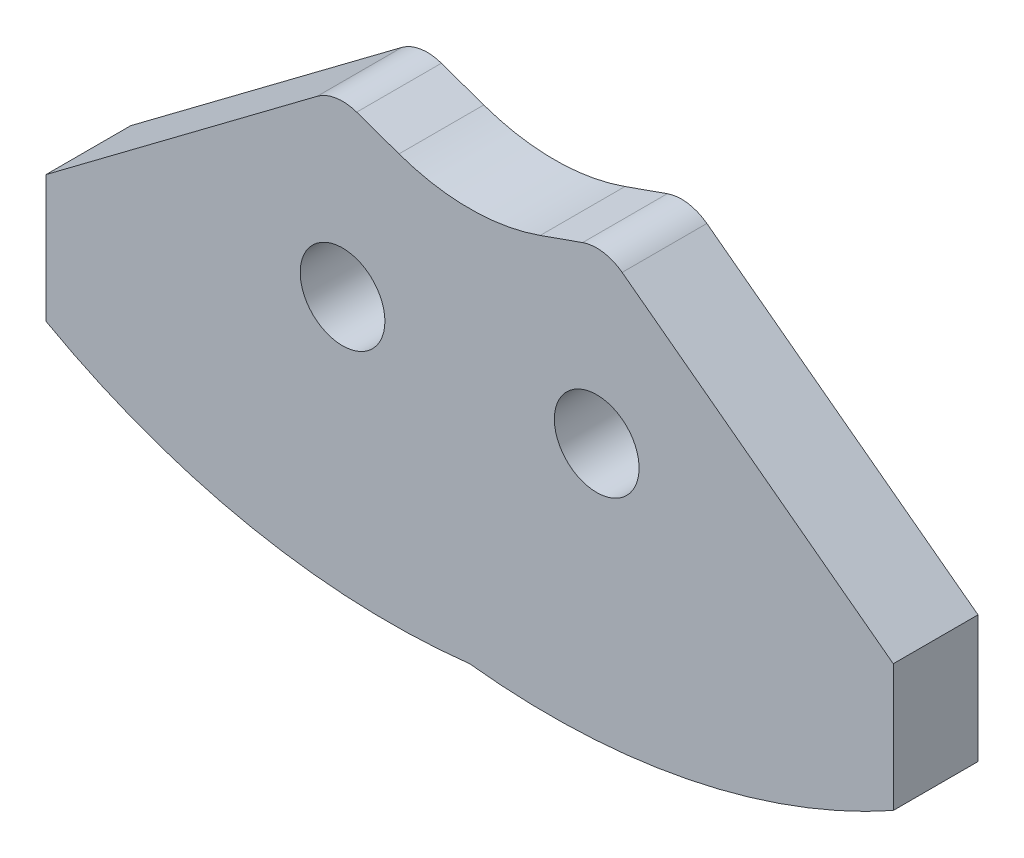
ISO-10303-21;
HEADER;
FILE_DESCRIPTION(('STEP AP214'),'2;1');
FILE_NAME('part.step','',(''),(''),'','','');
FILE_SCHEMA(('AUTOMOTIVE_DESIGN { 1 0 10303 214 1 1 1 1 }'));
ENDSEC;
DATA;
#1=APPLICATION_CONTEXT('core data for automotive mechanical design processes');
#2=APPLICATION_PROTOCOL_DEFINITION('international standard','automotive_design',2000,#1);
#3=PRODUCT_CONTEXT('',#1,'mechanical');
#4=PRODUCT('Part','Part','',(#3));
#5=PRODUCT_RELATED_PRODUCT_CATEGORY('part','',(#4));
#6=PRODUCT_DEFINITION_FORMATION('','',#4);
#7=PRODUCT_DEFINITION_CONTEXT('part definition',#1,'design');
#8=PRODUCT_DEFINITION('design','',#6,#7);
#9=PRODUCT_DEFINITION_SHAPE('','',#8);
#10=(LENGTH_UNIT() NAMED_UNIT(*) SI_UNIT(.MILLI.,.METRE.));
#11=(NAMED_UNIT(*) PLANE_ANGLE_UNIT() SI_UNIT($,.RADIAN.));
#12=(NAMED_UNIT(*) SI_UNIT($,.STERADIAN.) SOLID_ANGLE_UNIT());
#13=UNCERTAINTY_MEASURE_WITH_UNIT(LENGTH_MEASURE(1.E-05),#10,'distance_accuracy_value','');
#14=(GEOMETRIC_REPRESENTATION_CONTEXT(3) GLOBAL_UNCERTAINTY_ASSIGNED_CONTEXT((#13)) GLOBAL_UNIT_ASSIGNED_CONTEXT((#10,
#11,#12)) REPRESENTATION_CONTEXT('',''));
#15=CARTESIAN_POINT('',(0.,0.,0.));
#16=DIRECTION('',(0.,0.,1.));
#17=DIRECTION('',(1.,0.,0.));
#18=AXIS2_PLACEMENT_3D('',#15,#16,#17);
#19=CARTESIAN_POINT('',(34.999997698826,45.0000030682313,10.));
#20=DIRECTION('',(0.,0.,-1.));
#21=DIRECTION('',(-1.,0.,0.));
#22=AXIS2_PLACEMENT_3D('',#19,#20,#21);
#23=PLANE('',#22);
#24=CARTESIAN_POINT('',(34.999997698826,45.0000030682313,10.));
#25=DIRECTION('',(0.,0.,1.));
#26=DIRECTION('',(-1.,0.,0.));
#27=AXIS2_PLACEMENT_3D('',#24,#25,#26);
#28=CIRCLE('',#27,5.00000857665922);
#29=CARTESIAN_POINT('',(36.6666698275836,49.7140554419209,10.));
#30=VERTEX_POINT('',#29);
#31=CARTESIAN_POINT('',(31.9999913116336,49.0000089986608,10.));
#32=VERTEX_POINT('',#31);
#33=EDGE_CURVE('E191',#30,#32,#28,.T.);
#34=ORIENTED_EDGE('',*,*,#33,.T.);
#35=DIRECTION('',(-0.799999813820728,-0.600000248238949,0.));
#36=VECTOR('',#35,1.);
#37=CARTESIAN_POINT('',(0.,25.,10.));
#38=LINE('',#37,#36);
#39=CARTESIAN_POINT('',(0.,25.,10.));
#40=VERTEX_POINT('',#39);
#41=EDGE_CURVE('E109',#32,#40,#38,.T.);
#42=ORIENTED_EDGE('',*,*,#41,.T.);
#43=DIRECTION('',(0.,-1.,0.));
#44=VECTOR('',#43,1.);
#45=CARTESIAN_POINT('',(0.,10.,10.));
#46=LINE('',#45,#44);
#47=CARTESIAN_POINT('',(0.,10.,10.));
#48=VERTEX_POINT('',#47);
#49=EDGE_CURVE('E224',#40,#48,#46,.T.);
#50=ORIENTED_EDGE('',*,*,#49,.T.);
#51=CARTESIAN_POINT('',(40.5390973224483,82.6954866122414,10.));
#52=DIRECTION('',(0.,0.,1.));
#53=DIRECTION('',(1.,0.,0.));
#54=AXIS2_PLACEMENT_3D('',#51,#52,#53);
#55=CIRCLE('',#54,83.2349216705914);
#56=CARTESIAN_POINT('',(50.,0.,10.));
#57=VERTEX_POINT('',#56);
#58=EDGE_CURVE('E244',#48,#57,#55,.T.);
#59=ORIENTED_EDGE('',*,*,#58,.T.);
#60=CARTESIAN_POINT('',(59.4609026775517,82.6954866122414,10.));
#61=DIRECTION('',(0.,0.,1.));
#62=DIRECTION('',(-1.,0.,0.));
#63=AXIS2_PLACEMENT_3D('',#60,#61,#62);
#64=CIRCLE('',#63,83.2349216705914);
#65=CARTESIAN_POINT('',(100.,10.,10.));
#66=VERTEX_POINT('',#65);
#67=EDGE_CURVE('E240',#57,#66,#64,.T.);
#68=ORIENTED_EDGE('',*,*,#67,.T.);
#69=DIRECTION('',(0.,1.,0.));
#70=VECTOR('',#69,1.);
#71=CARTESIAN_POINT('',(100.,10.,10.));
#72=LINE('',#71,#70);
#73=CARTESIAN_POINT('',(100.,25.,10.));
#74=VERTEX_POINT('',#73);
#75=EDGE_CURVE('E243',#66,#74,#72,.T.);
#76=ORIENTED_EDGE('',*,*,#75,.T.);
#77=DIRECTION('',(-0.799999813820728,0.600000248238949,0.));
#78=VECTOR('',#77,1.);
#79=CARTESIAN_POINT('',(100.,25.,10.));
#80=LINE('',#79,#78);
#81=CARTESIAN_POINT('',(68.0000086883664,49.0000089986608,10.));
#82=VERTEX_POINT('',#81);
#83=EDGE_CURVE('E248',#74,#82,#80,.T.);
#84=ORIENTED_EDGE('',*,*,#83,.T.);
#85=CARTESIAN_POINT('',(65.000002301174,45.0000030682313,10.));
#86=DIRECTION('',(0.,0.,1.));
#87=DIRECTION('',(1.,0.,0.));
#88=AXIS2_PLACEMENT_3D('',#85,#86,#87);
#89=CIRCLE('',#88,5.00000857665922);
#90=CARTESIAN_POINT('',(63.3333301724164,49.7140554419209,10.));
#91=VERTEX_POINT('',#90);
#92=EDGE_CURVE('E137',#82,#91,#89,.T.);
#93=ORIENTED_EDGE('',*,*,#92,.T.);
#94=DIRECTION('',(-0.942808857507863,-0.333333853973336,0.));
#95=VECTOR('',#94,1.);
#96=CARTESIAN_POINT('',(58.3333463493335,47.9462911021182,10.));
#97=LINE('',#96,#95);
#98=CARTESIAN_POINT('',(58.3333463493335,47.9462911021182,10.));
#99=VERTEX_POINT('',#98);
#100=EDGE_CURVE('E131',#91,#99,#97,.T.);
#101=ORIENTED_EDGE('',*,*,#100,.T.);
#102=CARTESIAN_POINT('',(50.,71.5165125398148,10.));
#103=DIRECTION('',(0.,0.,-1.));
#104=DIRECTION('',(-1.,0.,0.));
#105=AXIS2_PLACEMENT_3D('',#102,#103,#104);
#106=CIRCLE('',#105,25.);
#107=CARTESIAN_POINT('',(41.6666536506665,47.9462911021182,10.));
#108=VERTEX_POINT('',#107);
#109=EDGE_CURVE('E135',#99,#108,#106,.T.);
#110=ORIENTED_EDGE('',*,*,#109,.T.);
#111=DIRECTION('',(-0.942808857507864,0.333333853973335,0.));
#112=VECTOR('',#111,1.);
#113=CARTESIAN_POINT('',(41.6666536506665,47.9462911021182,10.));
#114=LINE('',#113,#112);
#115=EDGE_CURVE('E57',#108,#30,#114,.T.);
#116=ORIENTED_EDGE('',*,*,#115,.T.);
#117=EDGE_LOOP('',(#34,#42,#50,#59,#68,#76,#84,#93,#101,#110,#116));
#118=FACE_BOUND('',#117,.T.);
#119=CARTESIAN_POINT('',(35.,30.,10.));
#120=DIRECTION('',(0.,0.,1.));
#121=DIRECTION('',(1.,0.,0.));
#122=AXIS2_PLACEMENT_3D('',#119,#120,#121);
#123=CIRCLE('',#122,5.);
#124=CARTESIAN_POINT('',(40.,30.,10.));
#125=VERTEX_POINT('',#124);
#126=EDGE_CURVE('E164',#125,#125,#123,.T.);
#127=ORIENTED_EDGE('',*,*,#126,.F.);
#128=EDGE_LOOP('',(#127));
#129=FACE_BOUND('',#128,.T.);
#130=CARTESIAN_POINT('',(65.,30.,10.));
#131=DIRECTION('',(0.,0.,1.));
#132=DIRECTION('',(-1.,0.,0.));
#133=AXIS2_PLACEMENT_3D('',#130,#131,#132);
#134=CIRCLE('',#133,5.);
#135=CARTESIAN_POINT('',(60.,30.,10.));
#136=VERTEX_POINT('',#135);
#137=EDGE_CURVE('E294',#136,#136,#134,.T.);
#138=ORIENTED_EDGE('',*,*,#137,.F.);
#139=EDGE_LOOP('',(#138));
#140=FACE_BOUND('',#139,.T.);
#141=ADVANCED_FACE('F39',(#118,#129,#140),#23,.F.);
#142=CARTESIAN_POINT('',(34.999997698826,45.0000030682313,0.));
#143=DIRECTION('',(0.,0.,-1.));
#144=DIRECTION('',(-1.,0.,0.));
#145=AXIS2_PLACEMENT_3D('',#142,#143,#144);
#146=PLANE('',#145);
#147=CARTESIAN_POINT('',(35.,30.,0.));
#148=DIRECTION('',(0.,0.,1.));
#149=DIRECTION('',(1.,0.,0.));
#150=AXIS2_PLACEMENT_3D('',#147,#148,#149);
#151=CIRCLE('',#150,5.);
#152=CARTESIAN_POINT('',(40.,30.,0.));
#153=VERTEX_POINT('',#152);
#154=EDGE_CURVE('E301',#153,#153,#151,.T.);
#155=ORIENTED_EDGE('',*,*,#154,.T.);
#156=EDGE_LOOP('',(#155));
#157=FACE_BOUND('',#156,.T.);
#158=CARTESIAN_POINT('',(34.999997698826,45.0000030682313,0.));
#159=DIRECTION('',(0.,0.,1.));
#160=DIRECTION('',(-1.,0.,0.));
#161=AXIS2_PLACEMENT_3D('',#158,#159,#160);
#162=CIRCLE('',#161,5.00000857665922);
#163=CARTESIAN_POINT('',(36.6666698275836,49.7140554419209,0.));
#164=VERTEX_POINT('',#163);
#165=CARTESIAN_POINT('',(31.9999913116336,49.0000089986608,0.));
#166=VERTEX_POINT('',#165);
#167=EDGE_CURVE('E159',#164,#166,#162,.T.);
#168=ORIENTED_EDGE('',*,*,#167,.F.);
#169=DIRECTION('',(-0.942808857507864,0.333333853973335,0.));
#170=VECTOR('',#169,1.);
#171=CARTESIAN_POINT('',(41.6666536506665,47.9462911021182,0.));
#172=LINE('',#171,#170);
#173=CARTESIAN_POINT('',(41.6666536506665,47.9462911021182,0.));
#174=VERTEX_POINT('',#173);
#175=EDGE_CURVE('E101',#174,#164,#172,.T.);
#176=ORIENTED_EDGE('',*,*,#175,.F.);
#177=CARTESIAN_POINT('',(50.,71.5165125398148,0.));
#178=DIRECTION('',(0.,0.,-1.));
#179=DIRECTION('',(-1.,0.,0.));
#180=AXIS2_PLACEMENT_3D('',#177,#178,#179);
#181=CIRCLE('',#180,25.);
#182=CARTESIAN_POINT('',(58.3333463493335,47.9462911021182,0.));
#183=VERTEX_POINT('',#182);
#184=EDGE_CURVE('E95',#183,#174,#181,.T.);
#185=ORIENTED_EDGE('',*,*,#184,.F.);
#186=DIRECTION('',(-0.942808857507863,-0.333333853973336,0.));
#187=VECTOR('',#186,1.);
#188=CARTESIAN_POINT('',(58.3333463493335,47.9462911021182,0.));
#189=LINE('',#188,#187);
#190=CARTESIAN_POINT('',(63.3333301724164,49.7140554419209,0.));
#191=VERTEX_POINT('',#190);
#192=EDGE_CURVE('E146',#191,#183,#189,.T.);
#193=ORIENTED_EDGE('',*,*,#192,.F.);
#194=CARTESIAN_POINT('',(65.000002301174,45.0000030682313,0.));
#195=DIRECTION('',(0.,0.,1.));
#196=DIRECTION('',(1.,0.,0.));
#197=AXIS2_PLACEMENT_3D('',#194,#195,#196);
#198=CIRCLE('',#197,5.00000857665922);
#199=CARTESIAN_POINT('',(68.0000086883664,49.0000089986608,0.));
#200=VERTEX_POINT('',#199);
#201=EDGE_CURVE('E182',#200,#191,#198,.T.);
#202=ORIENTED_EDGE('',*,*,#201,.F.);
#203=DIRECTION('',(-0.799999813820728,0.600000248238949,0.));
#204=VECTOR('',#203,1.);
#205=CARTESIAN_POINT('',(100.,25.,0.));
#206=LINE('',#205,#204);
#207=CARTESIAN_POINT('',(100.,25.,0.));
#208=VERTEX_POINT('',#207);
#209=EDGE_CURVE('E179',#208,#200,#206,.T.);
#210=ORIENTED_EDGE('',*,*,#209,.F.);
#211=DIRECTION('',(0.,1.,0.));
#212=VECTOR('',#211,1.);
#213=CARTESIAN_POINT('',(100.,10.,0.));
#214=LINE('',#213,#212);
#215=CARTESIAN_POINT('',(100.,10.,0.));
#216=VERTEX_POINT('',#215);
#217=EDGE_CURVE('E176',#216,#208,#214,.T.);
#218=ORIENTED_EDGE('',*,*,#217,.F.);
#219=CARTESIAN_POINT('',(59.4609026775517,82.6954866122414,0.));
#220=DIRECTION('',(0.,0.,1.));
#221=DIRECTION('',(-1.,0.,0.));
#222=AXIS2_PLACEMENT_3D('',#219,#220,#221);
#223=CIRCLE('',#222,83.2349216705914);
#224=CARTESIAN_POINT('',(50.,0.,0.));
#225=VERTEX_POINT('',#224);
#226=EDGE_CURVE('E173',#225,#216,#223,.T.);
#227=ORIENTED_EDGE('',*,*,#226,.F.);
#228=CARTESIAN_POINT('',(40.5390973224483,82.6954866122414,0.));
#229=DIRECTION('',(0.,0.,1.));
#230=DIRECTION('',(1.,0.,0.));
#231=AXIS2_PLACEMENT_3D('',#228,#229,#230);
#232=CIRCLE('',#231,83.2349216705914);
#233=CARTESIAN_POINT('',(0.,10.,0.));
#234=VERTEX_POINT('',#233);
#235=EDGE_CURVE('E170',#234,#225,#232,.T.);
#236=ORIENTED_EDGE('',*,*,#235,.F.);
#237=DIRECTION('',(0.,-1.,0.));
#238=VECTOR('',#237,1.);
#239=CARTESIAN_POINT('',(0.,10.,0.));
#240=LINE('',#239,#238);
#241=CARTESIAN_POINT('',(0.,25.,0.));
#242=VERTEX_POINT('',#241);
#243=EDGE_CURVE('E167',#242,#234,#240,.T.);
#244=ORIENTED_EDGE('',*,*,#243,.F.);
#245=DIRECTION('',(-0.799999813820728,-0.600000248238949,0.));
#246=VECTOR('',#245,1.);
#247=CARTESIAN_POINT('',(0.,25.,0.));
#248=LINE('',#247,#246);
#249=EDGE_CURVE('E163',#166,#242,#248,.T.);
#250=ORIENTED_EDGE('',*,*,#249,.F.);
#251=EDGE_LOOP('',(#168,#176,#185,#193,#202,#210,#218,#227,#236,#244,#250));
#252=FACE_BOUND('',#251,.T.);
#253=CARTESIAN_POINT('',(65.,30.,0.));
#254=DIRECTION('',(0.,0.,1.));
#255=DIRECTION('',(-1.,0.,0.));
#256=AXIS2_PLACEMENT_3D('',#253,#254,#255);
#257=CIRCLE('',#256,5.);
#258=CARTESIAN_POINT('',(60.,30.,0.));
#259=VERTEX_POINT('',#258);
#260=EDGE_CURVE('E297',#259,#259,#257,.T.);
#261=ORIENTED_EDGE('',*,*,#260,.T.);
#262=EDGE_LOOP('',(#261));
#263=FACE_BOUND('',#262,.T.);
#264=ADVANCED_FACE('F228',(#157,#252,#263),#146,.T.);
#265=CARTESIAN_POINT('',(34.999997698826,45.0000030682313,10.));
#266=DIRECTION('',(0.,0.,-1.));
#267=DIRECTION('',(-1.,0.,0.));
#268=AXIS2_PLACEMENT_3D('',#265,#266,#267);
#269=CYLINDRICAL_SURFACE('',#268,5.00000857665922);
#270=ORIENTED_EDGE('',*,*,#167,.T.);
#271=DIRECTION('',(0.,0.,-1.));
#272=VECTOR('',#271,1.);
#273=CARTESIAN_POINT('',(31.9999913116336,49.0000089986608,10.));
#274=LINE('',#273,#272);
#275=EDGE_CURVE('E11',#32,#166,#274,.T.);
#276=ORIENTED_EDGE('',*,*,#275,.F.);
#277=ORIENTED_EDGE('',*,*,#33,.F.);
#278=DIRECTION('',(0.,0.,-1.));
#279=VECTOR('',#278,1.);
#280=CARTESIAN_POINT('',(36.6666698275836,49.7140554419209,10.));
#281=LINE('',#280,#279);
#282=EDGE_CURVE('E155',#30,#164,#281,.T.);
#283=ORIENTED_EDGE('',*,*,#282,.T.);
#284=EDGE_LOOP('',(#270,#276,#277,#283));
#285=FACE_BOUND('',#284,.T.);
#286=ADVANCED_FACE('F41',(#285),#269,.T.);
#287=CARTESIAN_POINT('',(0.,25.,10.));
#288=DIRECTION('',(0.600000248238949,-0.799999813820728,0.));
#289=DIRECTION('',(0.799999813820728,0.600000248238949,0.));
#290=AXIS2_PLACEMENT_3D('',#287,#288,#289);
#291=PLANE('',#290);
#292=ORIENTED_EDGE('',*,*,#249,.T.);
#293=DIRECTION('',(0.,0.,-1.));
#294=VECTOR('',#293,1.);
#295=CARTESIAN_POINT('',(0.,25.,10.));
#296=LINE('',#295,#294);
#297=EDGE_CURVE('E49',#40,#242,#296,.T.);
#298=ORIENTED_EDGE('',*,*,#297,.F.);
#299=ORIENTED_EDGE('',*,*,#41,.F.);
#300=ORIENTED_EDGE('',*,*,#275,.T.);
#301=EDGE_LOOP('',(#292,#298,#299,#300));
#302=FACE_BOUND('',#301,.T.);
#303=ADVANCED_FACE('F391',(#302),#291,.F.);
#304=CARTESIAN_POINT('',(0.,10.,10.));
#305=DIRECTION('',(1.,0.,0.));
#306=DIRECTION('',(0.,1.,0.));
#307=AXIS2_PLACEMENT_3D('',#304,#305,#306);
#308=PLANE('',#307);
#309=ORIENTED_EDGE('',*,*,#243,.T.);
#310=DIRECTION('',(0.,0.,-1.));
#311=VECTOR('',#310,1.);
#312=CARTESIAN_POINT('',(0.,10.,10.));
#313=LINE('',#312,#311);
#314=EDGE_CURVE('E214',#48,#234,#313,.T.);
#315=ORIENTED_EDGE('',*,*,#314,.F.);
#316=ORIENTED_EDGE('',*,*,#49,.F.);
#317=ORIENTED_EDGE('',*,*,#297,.T.);
#318=EDGE_LOOP('',(#309,#315,#316,#317));
#319=FACE_BOUND('',#318,.T.);
#320=ADVANCED_FACE('F222',(#319),#308,.F.);
#321=CARTESIAN_POINT('',(40.5390973224483,82.6954866122414,10.));
#322=DIRECTION('',(0.,0.,-1.));
#323=DIRECTION('',(-1.,0.,0.));
#324=AXIS2_PLACEMENT_3D('',#321,#322,#323);
#325=CYLINDRICAL_SURFACE('',#324,83.2349216705914);
#326=ORIENTED_EDGE('',*,*,#235,.T.);
#327=DIRECTION('',(0.,0.,-1.));
#328=VECTOR('',#327,1.);
#329=CARTESIAN_POINT('',(50.,0.,10.));
#330=LINE('',#329,#328);
#331=EDGE_CURVE('E210',#57,#225,#330,.T.);
#332=ORIENTED_EDGE('',*,*,#331,.F.);
#333=ORIENTED_EDGE('',*,*,#58,.F.);
#334=ORIENTED_EDGE('',*,*,#314,.T.);
#335=EDGE_LOOP('',(#326,#332,#333,#334));
#336=FACE_BOUND('',#335,.T.);
#337=ADVANCED_FACE('F234',(#336),#325,.T.);
#338=CARTESIAN_POINT('',(59.4609026775517,82.6954866122414,10.));
#339=DIRECTION('',(0.,0.,-1.));
#340=DIRECTION('',(-1.,0.,0.));
#341=AXIS2_PLACEMENT_3D('',#338,#339,#340);
#342=CYLINDRICAL_SURFACE('',#341,83.2349216705914);
#343=ORIENTED_EDGE('',*,*,#226,.T.);
#344=DIRECTION('',(0.,0.,-1.));
#345=VECTOR('',#344,1.);
#346=CARTESIAN_POINT('',(100.,10.,10.));
#347=LINE('',#346,#345);
#348=EDGE_CURVE('E206',#66,#216,#347,.T.);
#349=ORIENTED_EDGE('',*,*,#348,.F.);
#350=ORIENTED_EDGE('',*,*,#67,.F.);
#351=ORIENTED_EDGE('',*,*,#331,.T.);
#352=EDGE_LOOP('',(#343,#349,#350,#351));
#353=FACE_BOUND('',#352,.T.);
#354=ADVANCED_FACE('F238',(#353),#342,.T.);
#355=CARTESIAN_POINT('',(100.,10.,10.));
#356=DIRECTION('',(-1.,0.,0.));
#357=DIRECTION('',(0.,-1.,0.));
#358=AXIS2_PLACEMENT_3D('',#355,#356,#357);
#359=PLANE('',#358);
#360=ORIENTED_EDGE('',*,*,#217,.T.);
#361=DIRECTION('',(0.,0.,-1.));
#362=VECTOR('',#361,1.);
#363=CARTESIAN_POINT('',(100.,25.,10.));
#364=LINE('',#363,#362);
#365=EDGE_CURVE('E202',#74,#208,#364,.T.);
#366=ORIENTED_EDGE('',*,*,#365,.F.);
#367=ORIENTED_EDGE('',*,*,#75,.F.);
#368=ORIENTED_EDGE('',*,*,#348,.T.);
#369=EDGE_LOOP('',(#360,#366,#367,#368));
#370=FACE_BOUND('',#369,.T.);
#371=ADVANCED_FACE('F357',(#370),#359,.F.);
#372=CARTESIAN_POINT('',(100.,25.,10.));
#373=DIRECTION('',(-0.600000248238949,-0.799999813820728,0.));
#374=DIRECTION('',(0.799999813820728,-0.600000248238949,0.));
#375=AXIS2_PLACEMENT_3D('',#372,#373,#374);
#376=PLANE('',#375);
#377=ORIENTED_EDGE('',*,*,#209,.T.);
#378=DIRECTION('',(0.,0.,-1.));
#379=VECTOR('',#378,1.);
#380=CARTESIAN_POINT('',(68.0000086883664,49.0000089986608,10.));
#381=LINE('',#380,#379);
#382=EDGE_CURVE('E198',#82,#200,#381,.T.);
#383=ORIENTED_EDGE('',*,*,#382,.F.);
#384=ORIENTED_EDGE('',*,*,#83,.F.);
#385=ORIENTED_EDGE('',*,*,#365,.T.);
#386=EDGE_LOOP('',(#377,#383,#384,#385));
#387=FACE_BOUND('',#386,.T.);
#388=ADVANCED_FACE('F259',(#387),#376,.F.);
#389=CARTESIAN_POINT('',(65.000002301174,45.0000030682313,10.));
#390=DIRECTION('',(0.,0.,-1.));
#391=DIRECTION('',(-1.,0.,0.));
#392=AXIS2_PLACEMENT_3D('',#389,#390,#391);
#393=CYLINDRICAL_SURFACE('',#392,5.00000857665922);
#394=ORIENTED_EDGE('',*,*,#201,.T.);
#395=DIRECTION('',(0.,0.,-1.));
#396=VECTOR('',#395,1.);
#397=CARTESIAN_POINT('',(63.3333301724164,49.7140554419209,10.));
#398=LINE('',#397,#396);
#399=EDGE_CURVE('E148',#91,#191,#398,.T.);
#400=ORIENTED_EDGE('',*,*,#399,.F.);
#401=ORIENTED_EDGE('',*,*,#92,.F.);
#402=ORIENTED_EDGE('',*,*,#382,.T.);
#403=EDGE_LOOP('',(#394,#400,#401,#402));
#404=FACE_BOUND('',#403,.T.);
#405=ADVANCED_FACE('F263',(#404),#393,.T.);
#406=CARTESIAN_POINT('',(58.3333463493335,47.9462911021182,10.));
#407=DIRECTION('',(0.333333853973336,-0.942808857507863,0.));
#408=DIRECTION('',(0.942808857507864,0.333333853973336,0.));
#409=AXIS2_PLACEMENT_3D('',#406,#407,#408);
#410=PLANE('',#409);
#411=ORIENTED_EDGE('',*,*,#192,.T.);
#412=DIRECTION('',(0.,0.,-1.));
#413=VECTOR('',#412,1.);
#414=CARTESIAN_POINT('',(58.3333463493335,47.9462911021182,10.));
#415=LINE('',#414,#413);
#416=EDGE_CURVE('E143',#99,#183,#415,.T.);
#417=ORIENTED_EDGE('',*,*,#416,.F.);
#418=ORIENTED_EDGE('',*,*,#100,.F.);
#419=ORIENTED_EDGE('',*,*,#399,.T.);
#420=EDGE_LOOP('',(#411,#417,#418,#419));
#421=FACE_BOUND('',#420,.T.);
#422=ADVANCED_FACE('F144',(#421),#410,.F.);
#423=CARTESIAN_POINT('',(50.,71.5165125398148,10.));
#424=DIRECTION('',(0.,0.,-1.));
#425=DIRECTION('',(-1.,0.,0.));
#426=AXIS2_PLACEMENT_3D('',#423,#424,#425);
#427=CYLINDRICAL_SURFACE('',#426,25.);
#428=ORIENTED_EDGE('',*,*,#184,.T.);
#429=DIRECTION('',(0.,0.,-1.));
#430=VECTOR('',#429,1.);
#431=CARTESIAN_POINT('',(41.6666536506665,47.9462911021182,10.));
#432=LINE('',#431,#430);
#433=EDGE_CURVE('E149',#108,#174,#432,.T.);
#434=ORIENTED_EDGE('',*,*,#433,.F.);
#435=ORIENTED_EDGE('',*,*,#109,.F.);
#436=ORIENTED_EDGE('',*,*,#416,.T.);
#437=EDGE_LOOP('',(#428,#434,#435,#436));
#438=FACE_BOUND('',#437,.T.);
#439=ADVANCED_FACE('F151',(#438),#427,.F.);
#440=CARTESIAN_POINT('',(41.6666536506665,47.9462911021182,10.));
#441=DIRECTION('',(-0.333333853973335,-0.942808857507864,0.));
#442=DIRECTION('',(0.942808857507864,-0.333333853973335,0.));
#443=AXIS2_PLACEMENT_3D('',#440,#441,#442);
#444=PLANE('',#443);
#445=ORIENTED_EDGE('',*,*,#175,.T.);
#446=ORIENTED_EDGE('',*,*,#282,.F.);
#447=ORIENTED_EDGE('',*,*,#115,.F.);
#448=ORIENTED_EDGE('',*,*,#433,.T.);
#449=EDGE_LOOP('',(#445,#446,#447,#448));
#450=FACE_BOUND('',#449,.T.);
#451=ADVANCED_FACE('F267',(#450),#444,.F.);
#452=CARTESIAN_POINT('',(35.,30.,10.));
#453=DIRECTION('',(0.,0.,-1.));
#454=DIRECTION('',(-1.,0.,0.));
#455=AXIS2_PLACEMENT_3D('',#452,#453,#454);
#456=CYLINDRICAL_SURFACE('',#455,5.);
#457=ORIENTED_EDGE('',*,*,#126,.T.);
#458=EDGE_LOOP('',(#457));
#459=FACE_BOUND('',#458,.T.);
#460=ORIENTED_EDGE('',*,*,#154,.F.);
#461=EDGE_LOOP('',(#460));
#462=FACE_BOUND('',#461,.T.);
#463=ADVANCED_FACE('F269',(#459,#462),#456,.F.);
#464=CARTESIAN_POINT('',(65.,30.,10.));
#465=DIRECTION('',(0.,0.,-1.));
#466=DIRECTION('',(-1.,0.,0.));
#467=AXIS2_PLACEMENT_3D('',#464,#465,#466);
#468=CYLINDRICAL_SURFACE('',#467,5.);
#469=ORIENTED_EDGE('',*,*,#137,.T.);
#470=EDGE_LOOP('',(#469));
#471=FACE_BOUND('',#470,.T.);
#472=ORIENTED_EDGE('',*,*,#260,.F.);
#473=EDGE_LOOP('',(#472));
#474=FACE_BOUND('',#473,.T.);
#475=ADVANCED_FACE('F275',(#471,#474),#468,.F.);
#476=CLOSED_SHELL('',(#141,#264,#286,#303,#320,#337,#354,#371,#388,#405,#422,#439,#451,#463,#475));
#477=MANIFOLD_SOLID_BREP('B2',#476);
#478=ADVANCED_BREP_SHAPE_REPRESENTATION('',(#18,#477),#14);
#479=SHAPE_DEFINITION_REPRESENTATION(#9,#478);
ENDSEC;
END-ISO-10303-21;
